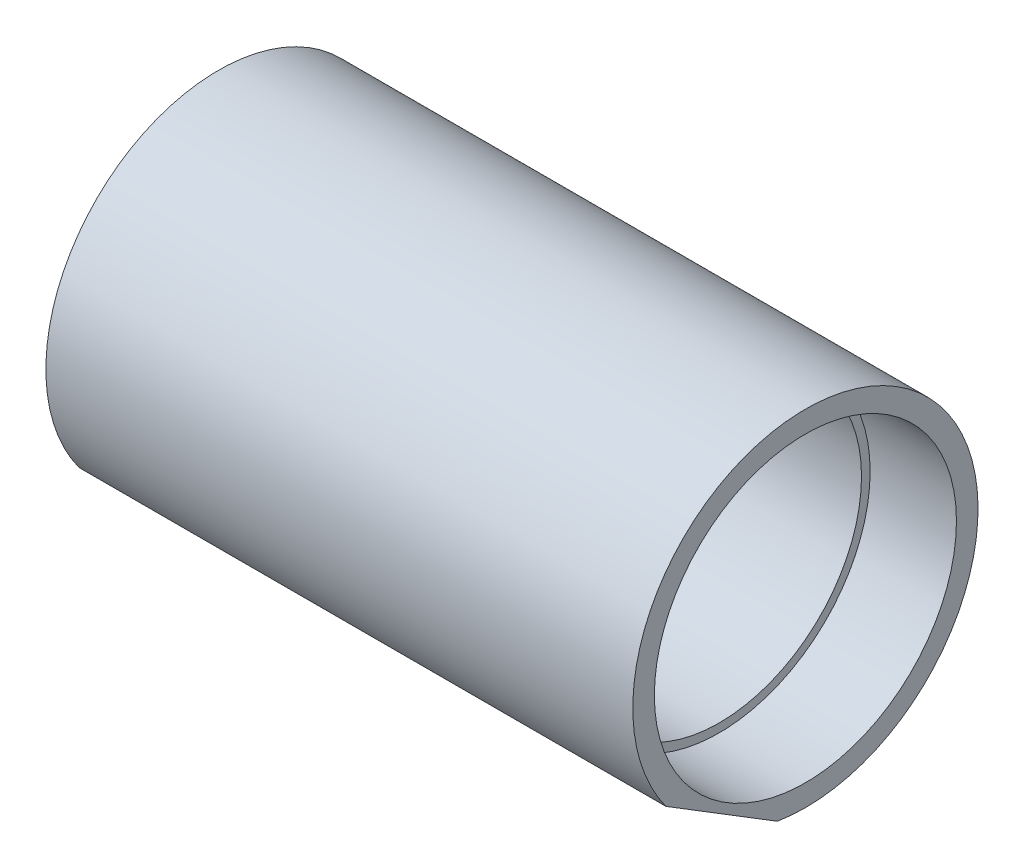
ISO-10303-21;
HEADER;
FILE_DESCRIPTION(('STEP AP214'),'2;1');
FILE_NAME('part.step','',(''),(''),'','','');
FILE_SCHEMA(('AUTOMOTIVE_DESIGN { 1 0 10303 214 1 1 1 1 }'));
ENDSEC;
DATA;
#1=APPLICATION_CONTEXT('core data for automotive mechanical design processes');
#2=APPLICATION_PROTOCOL_DEFINITION('international standard','automotive_design',2000,#1);
#3=PRODUCT_CONTEXT('',#1,'mechanical');
#4=PRODUCT('Part','Part','',(#3));
#5=PRODUCT_RELATED_PRODUCT_CATEGORY('part','',(#4));
#6=PRODUCT_DEFINITION_FORMATION('','',#4);
#7=PRODUCT_DEFINITION_CONTEXT('part definition',#1,'design');
#8=PRODUCT_DEFINITION('design','',#6,#7);
#9=PRODUCT_DEFINITION_SHAPE('','',#8);
#10=(LENGTH_UNIT() NAMED_UNIT(*) SI_UNIT(.MILLI.,.METRE.));
#11=(NAMED_UNIT(*) PLANE_ANGLE_UNIT() SI_UNIT($,.RADIAN.));
#12=(NAMED_UNIT(*) SI_UNIT($,.STERADIAN.) SOLID_ANGLE_UNIT());
#13=UNCERTAINTY_MEASURE_WITH_UNIT(LENGTH_MEASURE(1.E-05),#10,'distance_accuracy_value','');
#14=(GEOMETRIC_REPRESENTATION_CONTEXT(3) GLOBAL_UNCERTAINTY_ASSIGNED_CONTEXT((#13)) GLOBAL_UNIT_ASSIGNED_CONTEXT((#10,
#11,#12)) REPRESENTATION_CONTEXT('',''));
#15=CARTESIAN_POINT('',(0.,0.,0.));
#16=DIRECTION('',(0.,0.,1.));
#17=DIRECTION('',(1.,0.,0.));
#18=AXIS2_PLACEMENT_3D('',#15,#16,#17);
#19=CARTESIAN_POINT('',(-29.3825668529411,0.,0.));
#20=DIRECTION('',(-1.,0.,0.));
#21=DIRECTION('',(0.,0.,1.));
#22=AXIS2_PLACEMENT_3D('',#19,#20,#21);
#23=CYLINDRICAL_SURFACE('',#22,16.5);
#24=CARTESIAN_POINT('',(24.,0.,0.));
#25=DIRECTION('',(-1.,0.,0.));
#26=DIRECTION('',(0.,0.,1.));
#27=AXIS2_PLACEMENT_3D('',#24,#25,#26);
#28=CIRCLE('',#27,16.5);
#29=CARTESIAN_POINT('',(24.,0.,16.5));
#30=VERTEX_POINT('',#29);
#31=EDGE_CURVE('E19',#30,#30,#28,.F.);
#32=ORIENTED_EDGE('',*,*,#31,.T.);
#33=EDGE_LOOP('',(#32));
#34=FACE_BOUND('',#33,.T.);
#35=CARTESIAN_POINT('',(-24.,0.,0.));
#36=DIRECTION('',(-1.,0.,0.));
#37=DIRECTION('',(0.,0.,1.));
#38=AXIS2_PLACEMENT_3D('',#35,#36,#37);
#39=CIRCLE('',#38,16.5);
#40=CARTESIAN_POINT('',(-24.,0.,16.5));
#41=VERTEX_POINT('',#40);
#42=EDGE_CURVE('E69',#41,#41,#39,.T.);
#43=ORIENTED_EDGE('',*,*,#42,.T.);
#44=EDGE_LOOP('',(#43));
#45=FACE_BOUND('',#44,.T.);
#46=ADVANCED_FACE('F16',(#34,#45),#23,.F.);
#47=CARTESIAN_POINT('',(24.,0.,-17.5));
#48=DIRECTION('',(-1.,0.,0.));
#49=DIRECTION('',(0.,0.,1.));
#50=AXIS2_PLACEMENT_3D('',#47,#48,#49);
#51=PLANE('',#50);
#52=ORIENTED_EDGE('',*,*,#31,.F.);
#53=EDGE_LOOP('',(#52));
#54=FACE_BOUND('',#53,.T.);
#55=CARTESIAN_POINT('',(24.,0.,0.));
#56=DIRECTION('',(-1.,0.,0.));
#57=DIRECTION('',(0.,0.,1.));
#58=AXIS2_PLACEMENT_3D('',#55,#56,#57);
#59=CIRCLE('',#58,17.5);
#60=CARTESIAN_POINT('',(24.,0.,17.5));
#61=VERTEX_POINT('',#60);
#62=EDGE_CURVE('E67',#61,#61,#59,.F.);
#63=ORIENTED_EDGE('',*,*,#62,.T.);
#64=EDGE_LOOP('',(#63));
#65=FACE_BOUND('',#64,.T.);
#66=ADVANCED_FACE('F77',(#54,#65),#51,.F.);
#67=CARTESIAN_POINT('',(-24.,0.,-16.5));
#68=DIRECTION('',(1.,0.,0.));
#69=DIRECTION('',(0.,0.,-1.));
#70=AXIS2_PLACEMENT_3D('',#67,#68,#69);
#71=PLANE('',#70);
#72=CARTESIAN_POINT('',(-24.,0.,0.));
#73=DIRECTION('',(-1.,0.,0.));
#74=DIRECTION('',(0.,0.,1.));
#75=AXIS2_PLACEMENT_3D('',#72,#73,#74);
#76=CIRCLE('',#75,17.5);
#77=CARTESIAN_POINT('',(-24.,0.,17.5));
#78=VERTEX_POINT('',#77);
#79=EDGE_CURVE('E53',#78,#78,#76,.T.);
#80=ORIENTED_EDGE('',*,*,#79,.T.);
#81=EDGE_LOOP('',(#80));
#82=FACE_BOUND('',#81,.T.);
#83=ORIENTED_EDGE('',*,*,#42,.F.);
#84=EDGE_LOOP('',(#83));
#85=FACE_BOUND('',#84,.T.);
#86=ADVANCED_FACE('F80',(#82,#85),#71,.F.);
#87=CARTESIAN_POINT('',(-29.3825668529411,0.,0.));
#88=DIRECTION('',(-1.,0.,0.));
#89=DIRECTION('',(0.,0.,1.));
#90=AXIS2_PLACEMENT_3D('',#87,#88,#89);
#91=CYLINDRICAL_SURFACE('',#90,17.5);
#92=CARTESIAN_POINT('',(34.,0.,0.));
#93=DIRECTION('',(-1.,0.,0.));
#94=DIRECTION('',(0.,0.,1.));
#95=AXIS2_PLACEMENT_3D('',#92,#93,#94);
#96=CIRCLE('',#95,17.5);
#97=CARTESIAN_POINT('',(34.,0.,17.5));
#98=VERTEX_POINT('',#97);
#99=EDGE_CURVE('E52',#98,#98,#96,.F.);
#100=ORIENTED_EDGE('',*,*,#99,.T.);
#101=EDGE_LOOP('',(#100));
#102=FACE_BOUND('',#101,.T.);
#103=ORIENTED_EDGE('',*,*,#62,.F.);
#104=EDGE_LOOP('',(#103));
#105=FACE_BOUND('',#104,.T.);
#106=ADVANCED_FACE('F83',(#102,#105),#91,.F.);
#107=CARTESIAN_POINT('',(-29.3825668529411,0.,0.));
#108=DIRECTION('',(-1.,0.,0.));
#109=DIRECTION('',(0.,0.,1.));
#110=AXIS2_PLACEMENT_3D('',#107,#108,#109);
#111=CYLINDRICAL_SURFACE('',#110,17.5);
#112=ORIENTED_EDGE('',*,*,#79,.F.);
#113=EDGE_LOOP('',(#112));
#114=FACE_BOUND('',#113,.T.);
#115=CARTESIAN_POINT('',(-34.,0.,0.));
#116=DIRECTION('',(-1.,0.,0.));
#117=DIRECTION('',(0.,0.,1.));
#118=AXIS2_PLACEMENT_3D('',#115,#116,#117);
#119=CIRCLE('',#118,17.5);
#120=CARTESIAN_POINT('',(-34.,0.,17.5));
#121=VERTEX_POINT('',#120);
#122=EDGE_CURVE('E57',#121,#121,#119,.T.);
#123=ORIENTED_EDGE('',*,*,#122,.T.);
#124=EDGE_LOOP('',(#123));
#125=FACE_BOUND('',#124,.T.);
#126=ADVANCED_FACE('F85',(#114,#125),#111,.F.);
#127=CARTESIAN_POINT('',(157.06672193748,-11.7878541692375,16.1569333131256));
#128=DIRECTION('',(0.,0.851534635479749,-0.524298354544788));
#129=DIRECTION('',(0.,0.524298354544788,0.851534635479749));
#130=AXIS2_PLACEMENT_3D('',#127,#128,#129);
#131=PLANE('',#130);
#132=DIRECTION('',(-1.,0.,0.));
#133=VECTOR('',#132,1.);
#134=CARTESIAN_POINT('',(-29.3825668529411,-19.733947824628,3.25135406482603));
#135=LINE('',#134,#133);
#136=CARTESIAN_POINT('',(34.,-19.733947824628,3.25135406482605));
#137=VERTEX_POINT('',#136);
#138=CARTESIAN_POINT('',(-34.,-19.733947824628,3.25135406482603));
#139=VERTEX_POINT('',#138);
#140=EDGE_CURVE('E43',#137,#139,#135,.T.);
#141=ORIENTED_EDGE('',*,*,#140,.F.);
#142=DIRECTION('',(0.,0.524298354544788,0.851534635479748));
#143=VECTOR('',#142,1.);
#144=CARTESIAN_POINT('',(34.,-19.733947824628,3.25135406482604));
#145=LINE('',#144,#143);
#146=CARTESIAN_POINT('',(34.,-11.7878541692375,16.1569333131256));
#147=VERTEX_POINT('',#146);
#148=EDGE_CURVE('E49',#137,#147,#145,.T.);
#149=ORIENTED_EDGE('',*,*,#148,.T.);
#150=DIRECTION('',(-1.,0.,0.));
#151=VECTOR('',#150,1.);
#152=CARTESIAN_POINT('',(-29.3825668529411,-11.7878541692375,16.1569333131256));
#153=LINE('',#152,#151);
#154=CARTESIAN_POINT('',(-34.,-11.7878541692375,16.1569333131257));
#155=VERTEX_POINT('',#154);
#156=EDGE_CURVE('E45',#155,#147,#153,.F.);
#157=ORIENTED_EDGE('',*,*,#156,.F.);
#158=DIRECTION('',(0.,-0.524298354544788,-0.851534635479749));
#159=VECTOR('',#158,1.);
#160=CARTESIAN_POINT('',(-34.,-11.7878541692375,16.1569333131256));
#161=LINE('',#160,#159);
#162=EDGE_CURVE('E56',#155,#139,#161,.T.);
#163=ORIENTED_EDGE('',*,*,#162,.T.);
#164=EDGE_LOOP('',(#141,#149,#157,#163));
#165=FACE_BOUND('',#164,.T.);
#166=ADVANCED_FACE('F55',(#165),#131,.F.);
#167=CARTESIAN_POINT('',(34.,0.,-17.5));
#168=DIRECTION('',(-1.,0.,0.));
#169=DIRECTION('',(0.,0.,1.));
#170=AXIS2_PLACEMENT_3D('',#167,#168,#169);
#171=PLANE('',#170);
#172=ORIENTED_EDGE('',*,*,#99,.F.);
#173=EDGE_LOOP('',(#172));
#174=FACE_BOUND('',#173,.T.);
#175=ORIENTED_EDGE('',*,*,#148,.F.);
#176=CARTESIAN_POINT('',(34.,0.,0.));
#177=DIRECTION('',(-1.,0.,0.));
#178=DIRECTION('',(0.,0.,1.));
#179=AXIS2_PLACEMENT_3D('',#176,#177,#178);
#180=CIRCLE('',#179,20.);
#181=EDGE_CURVE('E25',#147,#137,#180,.T.);
#182=ORIENTED_EDGE('',*,*,#181,.F.);
#183=EDGE_LOOP('',(#175,#182));
#184=FACE_BOUND('',#183,.T.);
#185=ADVANCED_FACE('F50',(#174,#184),#171,.F.);
#186=CARTESIAN_POINT('',(-34.,0.,-20.));
#187=DIRECTION('',(1.,0.,0.));
#188=DIRECTION('',(0.,0.,-1.));
#189=AXIS2_PLACEMENT_3D('',#186,#187,#188);
#190=PLANE('',#189);
#191=CARTESIAN_POINT('',(-34.,0.,0.));
#192=DIRECTION('',(-1.,0.,0.));
#193=DIRECTION('',(0.,0.,1.));
#194=AXIS2_PLACEMENT_3D('',#191,#192,#193);
#195=CIRCLE('',#194,20.);
#196=EDGE_CURVE('E11',#139,#155,#195,.F.);
#197=ORIENTED_EDGE('',*,*,#196,.F.);
#198=ORIENTED_EDGE('',*,*,#162,.F.);
#199=EDGE_LOOP('',(#197,#198));
#200=FACE_BOUND('',#199,.T.);
#201=ORIENTED_EDGE('',*,*,#122,.F.);
#202=EDGE_LOOP('',(#201));
#203=FACE_BOUND('',#202,.T.);
#204=ADVANCED_FACE('F98',(#200,#203),#190,.F.);
#205=CARTESIAN_POINT('',(-29.3825668529411,0.,0.));
#206=DIRECTION('',(-1.,0.,0.));
#207=DIRECTION('',(0.,0.,1.));
#208=AXIS2_PLACEMENT_3D('',#205,#206,#207);
#209=CYLINDRICAL_SURFACE('',#208,20.);
#210=ORIENTED_EDGE('',*,*,#196,.T.);
#211=ORIENTED_EDGE('',*,*,#156,.T.);
#212=ORIENTED_EDGE('',*,*,#181,.T.);
#213=ORIENTED_EDGE('',*,*,#140,.T.);
#214=EDGE_LOOP('',(#210,#211,#212,#213));
#215=FACE_BOUND('',#214,.T.);
#216=ADVANCED_FACE('F41',(#215),#209,.T.);
#217=CLOSED_SHELL('',(#46,#66,#86,#106,#126,#166,#185,#204,#216));
#218=MANIFOLD_SOLID_BREP('B1',#217);
#219=ADVANCED_BREP_SHAPE_REPRESENTATION('',(#18,#218),#14);
#220=SHAPE_DEFINITION_REPRESENTATION(#9,#219);
ENDSEC;
END-ISO-10303-21;
